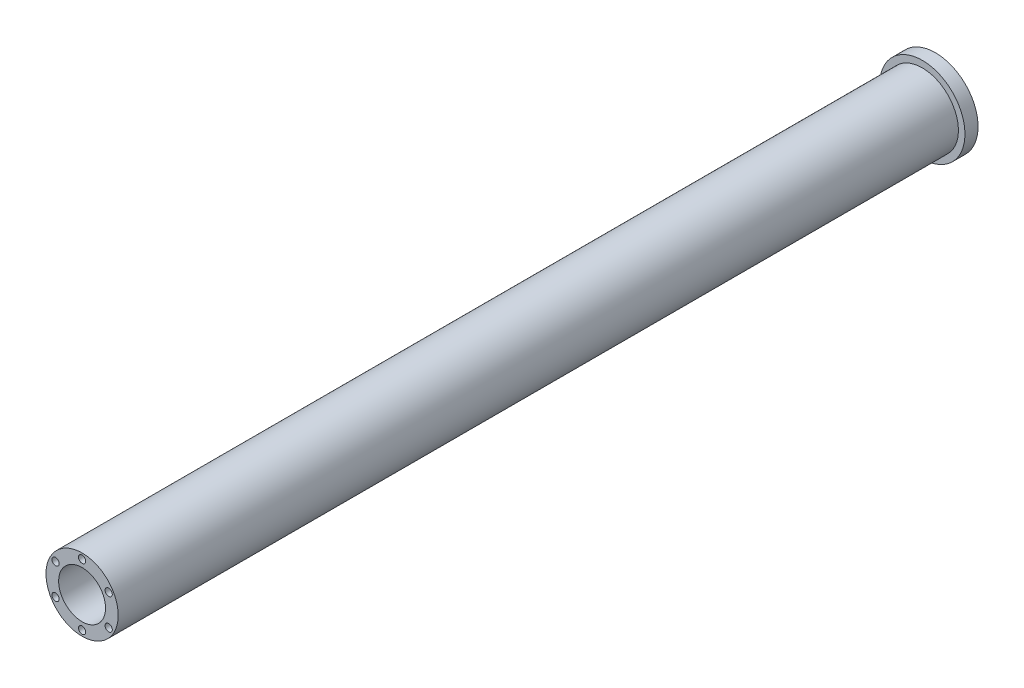
ISO-10303-21;
HEADER;
FILE_DESCRIPTION(('STEP AP214'),'2;1');
FILE_NAME('part.step','',(''),(''),'','','');
FILE_SCHEMA(('AUTOMOTIVE_DESIGN { 1 0 10303 214 1 1 1 1 }'));
ENDSEC;
DATA;
#1=APPLICATION_CONTEXT('core data for automotive mechanical design processes');
#2=APPLICATION_PROTOCOL_DEFINITION('international standard','automotive_design',2000,#1);
#3=PRODUCT_CONTEXT('',#1,'mechanical');
#4=PRODUCT('Part','Part','',(#3));
#5=PRODUCT_RELATED_PRODUCT_CATEGORY('part','',(#4));
#6=PRODUCT_DEFINITION_FORMATION('','',#4);
#7=PRODUCT_DEFINITION_CONTEXT('part definition',#1,'design');
#8=PRODUCT_DEFINITION('design','',#6,#7);
#9=PRODUCT_DEFINITION_SHAPE('','',#8);
#10=(LENGTH_UNIT() NAMED_UNIT(*) SI_UNIT(.MILLI.,.METRE.));
#11=(NAMED_UNIT(*) PLANE_ANGLE_UNIT() SI_UNIT($,.RADIAN.));
#12=(NAMED_UNIT(*) SI_UNIT($,.STERADIAN.) SOLID_ANGLE_UNIT());
#13=UNCERTAINTY_MEASURE_WITH_UNIT(LENGTH_MEASURE(1.E-05),#10,'distance_accuracy_value','');
#14=(GEOMETRIC_REPRESENTATION_CONTEXT(3) GLOBAL_UNCERTAINTY_ASSIGNED_CONTEXT((#13)) GLOBAL_UNIT_ASSIGNED_CONTEXT((#10,
#11,#12)) REPRESENTATION_CONTEXT('',''));
#15=CARTESIAN_POINT('',(0.,0.,0.));
#16=DIRECTION('',(0.,0.,1.));
#17=DIRECTION('',(1.,0.,0.));
#18=AXIS2_PLACEMENT_3D('',#15,#16,#17);
#19=CARTESIAN_POINT('',(0.,0.,90.));
#20=DIRECTION('',(0.,0.,1.));
#21=DIRECTION('',(1.,0.,0.));
#22=AXIS2_PLACEMENT_3D('',#19,#20,#21);
#23=PLANE('',#22);
#24=CARTESIAN_POINT('',(0.,0.,90.));
#25=DIRECTION('',(0.,0.,1.));
#26=DIRECTION('',(1.,0.,0.));
#27=AXIS2_PLACEMENT_3D('',#24,#25,#26);
#28=CIRCLE('',#27,13.);
#29=CARTESIAN_POINT('',(-13.,0.,90.));
#30=VERTEX_POINT('',#29);
#31=EDGE_CURVE('E135',#30,#30,#28,.T.);
#32=ORIENTED_EDGE('',*,*,#31,.T.);
#33=EDGE_LOOP('',(#32));
#34=FACE_BOUND('',#33,.T.);
#35=CARTESIAN_POINT('',(0.,0.,90.));
#36=DIRECTION('',(0.,0.,1.));
#37=DIRECTION('',(1.,0.,0.));
#38=AXIS2_PLACEMENT_3D('',#35,#36,#37);
#39=CIRCLE('',#38,23.6363636363636);
#40=CARTESIAN_POINT('',(-23.6363636363636,0.,90.));
#41=VERTEX_POINT('',#40);
#42=EDGE_CURVE('E11',#41,#41,#39,.T.);
#43=ORIENTED_EDGE('',*,*,#42,.F.);
#44=EDGE_LOOP('',(#43));
#45=FACE_BOUND('',#44,.T.);
#46=ADVANCED_FACE('F17',(#34,#45),#23,.F.);
#47=CARTESIAN_POINT('',(0.,0.,97.2727272727273));
#48=DIRECTION('',(0.,0.,1.));
#49=DIRECTION('',(1.,0.,0.));
#50=AXIS2_PLACEMENT_3D('',#47,#48,#49);
#51=PLANE('',#50);
#52=CARTESIAN_POINT('',(0.,0.,97.2727272727273));
#53=DIRECTION('',(0.,0.,-1.));
#54=DIRECTION('',(1.,0.,0.));
#55=AXIS2_PLACEMENT_3D('',#52,#53,#54);
#56=CIRCLE('',#55,20.);
#57=CARTESIAN_POINT('',(-20.,0.,97.2727272727273));
#58=VERTEX_POINT('',#57);
#59=EDGE_CURVE('E200',#58,#58,#56,.T.);
#60=ORIENTED_EDGE('',*,*,#59,.T.);
#61=EDGE_LOOP('',(#60));
#62=FACE_BOUND('',#61,.T.);
#63=CARTESIAN_POINT('',(0.,0.,97.2727272727273));
#64=DIRECTION('',(0.,0.,1.));
#65=DIRECTION('',(1.,0.,0.));
#66=AXIS2_PLACEMENT_3D('',#63,#64,#65);
#67=CIRCLE('',#66,23.6363636363636);
#68=CARTESIAN_POINT('',(-23.6363636363636,0.,97.2727272727273));
#69=VERTEX_POINT('',#68);
#70=EDGE_CURVE('E201',#69,#69,#67,.T.);
#71=ORIENTED_EDGE('',*,*,#70,.T.);
#72=EDGE_LOOP('',(#71));
#73=FACE_BOUND('',#72,.T.);
#74=ADVANCED_FACE('F213',(#62,#73),#51,.T.);
#75=CARTESIAN_POINT('',(0.,0.,90.));
#76=DIRECTION('',(0.,0.,1.));
#77=DIRECTION('',(1.,0.,0.));
#78=AXIS2_PLACEMENT_3D('',#75,#76,#77);
#79=CYLINDRICAL_SURFACE('',#78,23.6363636363636);
#80=ORIENTED_EDGE('',*,*,#70,.F.);
#81=DIRECTION('',(0.,0.,-1.));
#82=VECTOR('',#81,1.);
#83=CARTESIAN_POINT('',(-23.6363636363636,0.,90.));
#84=LINE('',#83,#82);
#85=EDGE_CURVE('E28',#69,#41,#84,.T.);
#86=ORIENTED_EDGE('',*,*,#85,.T.);
#87=ORIENTED_EDGE('',*,*,#42,.T.);
#88=ORIENTED_EDGE('',*,*,#85,.F.);
#89=EDGE_LOOP('',(#80,#86,#87,#88));
#90=FACE_BOUND('',#89,.T.);
#91=ADVANCED_FACE('F173',(#90),#79,.T.);
#92=CARTESIAN_POINT('',(0.,0.,562.727272727273));
#93=DIRECTION('',(0.,0.,1.));
#94=DIRECTION('',(1.,0.,0.));
#95=AXIS2_PLACEMENT_3D('',#92,#93,#94);
#96=PLANE('',#95);
#97=CARTESIAN_POINT('',(0.,0.,562.727272727273));
#98=DIRECTION('',(0.,0.,-1.));
#99=DIRECTION('',(1.,0.,0.));
#100=AXIS2_PLACEMENT_3D('',#97,#98,#99);
#101=CIRCLE('',#100,13.);
#102=CARTESIAN_POINT('',(-13.,0.,562.727272727273));
#103=VERTEX_POINT('',#102);
#104=EDGE_CURVE('E154',#103,#103,#101,.T.);
#105=ORIENTED_EDGE('',*,*,#104,.T.);
#106=EDGE_LOOP('',(#105));
#107=FACE_BOUND('',#106,.T.);
#108=CARTESIAN_POINT('',(0.,17.,562.727272727273));
#109=DIRECTION('',(0.,0.,-1.));
#110=DIRECTION('',(1.,0.,0.));
#111=AXIS2_PLACEMENT_3D('',#108,#109,#110);
#112=CIRCLE('',#111,2.);
#113=CARTESIAN_POINT('',(-2.,17.,562.727272727273));
#114=VERTEX_POINT('',#113);
#115=EDGE_CURVE('E177',#114,#114,#112,.T.);
#116=ORIENTED_EDGE('',*,*,#115,.T.);
#117=EDGE_LOOP('',(#116));
#118=FACE_BOUND('',#117,.T.);
#119=CARTESIAN_POINT('',(-14.7224318643355,-8.5,562.727272727273));
#120=DIRECTION('',(0.,0.,-1.));
#121=DIRECTION('',(1.,0.,0.));
#122=AXIS2_PLACEMENT_3D('',#119,#120,#121);
#123=CIRCLE('',#122,2.);
#124=CARTESIAN_POINT('',(-16.7224318643355,-8.5,562.727272727273));
#125=VERTEX_POINT('',#124);
#126=EDGE_CURVE('E99',#125,#125,#123,.T.);
#127=ORIENTED_EDGE('',*,*,#126,.T.);
#128=EDGE_LOOP('',(#127));
#129=FACE_BOUND('',#128,.T.);
#130=CARTESIAN_POINT('',(0.,-17.,562.727272727273));
#131=DIRECTION('',(0.,0.,-1.));
#132=DIRECTION('',(1.,0.,0.));
#133=AXIS2_PLACEMENT_3D('',#130,#131,#132);
#134=CIRCLE('',#133,2.);
#135=CARTESIAN_POINT('',(-2.,-17.,562.727272727273));
#136=VERTEX_POINT('',#135);
#137=EDGE_CURVE('E128',#136,#136,#134,.T.);
#138=ORIENTED_EDGE('',*,*,#137,.T.);
#139=EDGE_LOOP('',(#138));
#140=FACE_BOUND('',#139,.T.);
#141=CARTESIAN_POINT('',(14.7224318643355,8.5,562.727272727273));
#142=DIRECTION('',(0.,0.,-1.));
#143=DIRECTION('',(1.,0.,0.));
#144=AXIS2_PLACEMENT_3D('',#141,#142,#143);
#145=CIRCLE('',#144,2.);
#146=CARTESIAN_POINT('',(12.7224318643355,8.5,562.727272727273));
#147=VERTEX_POINT('',#146);
#148=EDGE_CURVE('E117',#147,#147,#145,.T.);
#149=ORIENTED_EDGE('',*,*,#148,.T.);
#150=EDGE_LOOP('',(#149));
#151=FACE_BOUND('',#150,.T.);
#152=CARTESIAN_POINT('',(-14.7224318643355,8.5,562.727272727273));
#153=DIRECTION('',(0.,0.,-1.));
#154=DIRECTION('',(1.,0.,0.));
#155=AXIS2_PLACEMENT_3D('',#152,#153,#154);
#156=CIRCLE('',#155,2.);
#157=CARTESIAN_POINT('',(-16.7224318643355,8.5,562.727272727273));
#158=VERTEX_POINT('',#157);
#159=EDGE_CURVE('E119',#158,#158,#156,.T.);
#160=ORIENTED_EDGE('',*,*,#159,.T.);
#161=EDGE_LOOP('',(#160));
#162=FACE_BOUND('',#161,.T.);
#163=CARTESIAN_POINT('',(14.7224318643355,-8.5,562.727272727273));
#164=DIRECTION('',(0.,0.,-1.));
#165=DIRECTION('',(1.,0.,0.));
#166=AXIS2_PLACEMENT_3D('',#163,#164,#165);
#167=CIRCLE('',#166,2.);
#168=CARTESIAN_POINT('',(12.7224318643355,-8.5,562.727272727273));
#169=VERTEX_POINT('',#168);
#170=EDGE_CURVE('E142',#169,#169,#167,.T.);
#171=ORIENTED_EDGE('',*,*,#170,.T.);
#172=EDGE_LOOP('',(#171));
#173=FACE_BOUND('',#172,.T.);
#174=CARTESIAN_POINT('',(0.,0.,562.727272727273));
#175=DIRECTION('',(0.,0.,1.));
#176=DIRECTION('',(1.,0.,0.));
#177=AXIS2_PLACEMENT_3D('',#174,#175,#176);
#178=CIRCLE('',#177,20.);
#179=CARTESIAN_POINT('',(-20.,0.,562.727272727273));
#180=VERTEX_POINT('',#179);
#181=EDGE_CURVE('E130',#180,#180,#178,.T.);
#182=ORIENTED_EDGE('',*,*,#181,.T.);
#183=EDGE_LOOP('',(#182));
#184=FACE_BOUND('',#183,.T.);
#185=ADVANCED_FACE('F104',(#107,#118,#129,#140,#151,#162,#173,#184),#96,.T.);
#186=CARTESIAN_POINT('',(0.,0.,90.));
#187=DIRECTION('',(0.,0.,1.));
#188=DIRECTION('',(1.,0.,0.));
#189=AXIS2_PLACEMENT_3D('',#186,#187,#188);
#190=CYLINDRICAL_SURFACE('',#189,20.);
#191=ORIENTED_EDGE('',*,*,#181,.F.);
#192=DIRECTION('',(0.,0.,-1.));
#193=VECTOR('',#192,1.);
#194=CARTESIAN_POINT('',(-20.,0.,90.));
#195=LINE('',#194,#193);
#196=EDGE_CURVE('E134',#180,#58,#195,.T.);
#197=ORIENTED_EDGE('',*,*,#196,.T.);
#198=ORIENTED_EDGE('',*,*,#59,.F.);
#199=ORIENTED_EDGE('',*,*,#196,.F.);
#200=EDGE_LOOP('',(#191,#197,#198,#199));
#201=FACE_BOUND('',#200,.T.);
#202=ADVANCED_FACE('F172',(#201),#190,.T.);
#203=CARTESIAN_POINT('',(0.,0.,562.727272727273));
#204=DIRECTION('',(0.,0.,-1.));
#205=DIRECTION('',(1.,0.,0.));
#206=AXIS2_PLACEMENT_3D('',#203,#204,#205);
#207=CYLINDRICAL_SURFACE('',#206,13.);
#208=ORIENTED_EDGE('',*,*,#104,.F.);
#209=DIRECTION('',(0.,0.,-1.));
#210=VECTOR('',#209,1.);
#211=CARTESIAN_POINT('',(-13.,0.,562.727272727273));
#212=LINE('',#211,#210);
#213=EDGE_CURVE('E150',#103,#30,#212,.T.);
#214=ORIENTED_EDGE('',*,*,#213,.T.);
#215=ORIENTED_EDGE('',*,*,#31,.F.);
#216=ORIENTED_EDGE('',*,*,#213,.F.);
#217=EDGE_LOOP('',(#208,#214,#215,#216));
#218=FACE_BOUND('',#217,.T.);
#219=ADVANCED_FACE('F166',(#218),#207,.F.);
#220=CARTESIAN_POINT('',(0.,17.,542.727272727273));
#221=DIRECTION('',(0.,0.,1.));
#222=DIRECTION('',(1.,0.,0.));
#223=AXIS2_PLACEMENT_3D('',#220,#221,#222);
#224=PLANE('',#223);
#225=CARTESIAN_POINT('',(0.,17.,542.727272727273));
#226=DIRECTION('',(0.,0.,-1.));
#227=DIRECTION('',(1.,0.,0.));
#228=AXIS2_PLACEMENT_3D('',#225,#226,#227);
#229=CIRCLE('',#228,2.);
#230=CARTESIAN_POINT('',(-2.,17.,542.727272727273));
#231=VERTEX_POINT('',#230);
#232=EDGE_CURVE('E158',#231,#231,#229,.T.);
#233=ORIENTED_EDGE('',*,*,#232,.F.);
#234=EDGE_LOOP('',(#233));
#235=FACE_BOUND('',#234,.T.);
#236=ADVANCED_FACE('F19',(#235),#224,.T.);
#237=CARTESIAN_POINT('',(0.,17.,562.727272727273));
#238=DIRECTION('',(0.,0.,-1.));
#239=DIRECTION('',(1.,0.,0.));
#240=AXIS2_PLACEMENT_3D('',#237,#238,#239);
#241=CYLINDRICAL_SURFACE('',#240,2.);
#242=ORIENTED_EDGE('',*,*,#115,.F.);
#243=DIRECTION('',(0.,0.,-1.));
#244=VECTOR('',#243,1.);
#245=CARTESIAN_POINT('',(-2.,17.,562.727272727273));
#246=LINE('',#245,#244);
#247=EDGE_CURVE('E181',#114,#231,#246,.T.);
#248=ORIENTED_EDGE('',*,*,#247,.T.);
#249=ORIENTED_EDGE('',*,*,#232,.T.);
#250=ORIENTED_EDGE('',*,*,#247,.F.);
#251=EDGE_LOOP('',(#242,#248,#249,#250));
#252=FACE_BOUND('',#251,.T.);
#253=ADVANCED_FACE('F336',(#252),#241,.F.);
#254=CARTESIAN_POINT('',(-14.7224318643355,-8.5,542.727272727273));
#255=DIRECTION('',(0.,0.,1.));
#256=DIRECTION('',(1.,0.,0.));
#257=AXIS2_PLACEMENT_3D('',#254,#255,#256);
#258=PLANE('',#257);
#259=CARTESIAN_POINT('',(-14.7224318643355,-8.5,542.727272727273));
#260=DIRECTION('',(0.,0.,-1.));
#261=DIRECTION('',(1.,0.,0.));
#262=AXIS2_PLACEMENT_3D('',#259,#260,#261);
#263=CIRCLE('',#262,2.);
#264=CARTESIAN_POINT('',(-16.7224318643355,-8.5,542.727272727273));
#265=VERTEX_POINT('',#264);
#266=EDGE_CURVE('E101',#265,#265,#263,.T.);
#267=ORIENTED_EDGE('',*,*,#266,.F.);
#268=EDGE_LOOP('',(#267));
#269=FACE_BOUND('',#268,.T.);
#270=ADVANCED_FACE('F308',(#269),#258,.T.);
#271=CARTESIAN_POINT('',(-14.7224318643355,-8.5,562.727272727273));
#272=DIRECTION('',(0.,0.,-1.));
#273=DIRECTION('',(1.,0.,0.));
#274=AXIS2_PLACEMENT_3D('',#271,#272,#273);
#275=CYLINDRICAL_SURFACE('',#274,2.);
#276=ORIENTED_EDGE('',*,*,#126,.F.);
#277=DIRECTION('',(0.,0.,-1.));
#278=VECTOR('',#277,1.);
#279=CARTESIAN_POINT('',(-16.7224318643355,-8.5,562.727272727273));
#280=LINE('',#279,#278);
#281=EDGE_CURVE('E96',#125,#265,#280,.T.);
#282=ORIENTED_EDGE('',*,*,#281,.T.);
#283=ORIENTED_EDGE('',*,*,#266,.T.);
#284=ORIENTED_EDGE('',*,*,#281,.F.);
#285=EDGE_LOOP('',(#276,#282,#283,#284));
#286=FACE_BOUND('',#285,.T.);
#287=ADVANCED_FACE('F98',(#286),#275,.F.);
#288=CARTESIAN_POINT('',(0.,-17.,542.727272727273));
#289=DIRECTION('',(0.,0.,1.));
#290=DIRECTION('',(1.,0.,0.));
#291=AXIS2_PLACEMENT_3D('',#288,#289,#290);
#292=PLANE('',#291);
#293=CARTESIAN_POINT('',(0.,-17.,542.727272727273));
#294=DIRECTION('',(0.,0.,-1.));
#295=DIRECTION('',(1.,0.,0.));
#296=AXIS2_PLACEMENT_3D('',#293,#294,#295);
#297=CIRCLE('',#296,2.);
#298=CARTESIAN_POINT('',(-2.,-17.,542.727272727273));
#299=VERTEX_POINT('',#298);
#300=EDGE_CURVE('E107',#299,#299,#297,.T.);
#301=ORIENTED_EDGE('',*,*,#300,.F.);
#302=EDGE_LOOP('',(#301));
#303=FACE_BOUND('',#302,.T.);
#304=ADVANCED_FACE('F307',(#303),#292,.T.);
#305=CARTESIAN_POINT('',(0.,-17.,562.727272727273));
#306=DIRECTION('',(0.,0.,-1.));
#307=DIRECTION('',(1.,0.,0.));
#308=AXIS2_PLACEMENT_3D('',#305,#306,#307);
#309=CYLINDRICAL_SURFACE('',#308,2.);
#310=ORIENTED_EDGE('',*,*,#137,.F.);
#311=DIRECTION('',(0.,0.,-1.));
#312=VECTOR('',#311,1.);
#313=CARTESIAN_POINT('',(-2.,-17.,562.727272727273));
#314=LINE('',#313,#312);
#315=EDGE_CURVE('E113',#136,#299,#314,.T.);
#316=ORIENTED_EDGE('',*,*,#315,.T.);
#317=ORIENTED_EDGE('',*,*,#300,.T.);
#318=ORIENTED_EDGE('',*,*,#315,.F.);
#319=EDGE_LOOP('',(#310,#316,#317,#318));
#320=FACE_BOUND('',#319,.T.);
#321=ADVANCED_FACE('F329',(#320),#309,.F.);
#322=CARTESIAN_POINT('',(14.7224318643355,8.5,542.727272727273));
#323=DIRECTION('',(0.,0.,1.));
#324=DIRECTION('',(1.,0.,0.));
#325=AXIS2_PLACEMENT_3D('',#322,#323,#324);
#326=PLANE('',#325);
#327=CARTESIAN_POINT('',(14.7224318643355,8.5,542.727272727273));
#328=DIRECTION('',(0.,0.,-1.));
#329=DIRECTION('',(1.,0.,0.));
#330=AXIS2_PLACEMENT_3D('',#327,#328,#329);
#331=CIRCLE('',#330,2.);
#332=CARTESIAN_POINT('',(12.7224318643355,8.5,542.727272727273));
#333=VERTEX_POINT('',#332);
#334=EDGE_CURVE('E125',#333,#333,#331,.T.);
#335=ORIENTED_EDGE('',*,*,#334,.F.);
#336=EDGE_LOOP('',(#335));
#337=FACE_BOUND('',#336,.T.);
#338=ADVANCED_FACE('F323',(#337),#326,.T.);
#339=CARTESIAN_POINT('',(14.7224318643355,8.5,562.727272727273));
#340=DIRECTION('',(0.,0.,-1.));
#341=DIRECTION('',(1.,0.,0.));
#342=AXIS2_PLACEMENT_3D('',#339,#340,#341);
#343=CYLINDRICAL_SURFACE('',#342,2.);
#344=ORIENTED_EDGE('',*,*,#148,.F.);
#345=DIRECTION('',(0.,0.,-1.));
#346=VECTOR('',#345,1.);
#347=CARTESIAN_POINT('',(12.7224318643355,8.5,562.727272727273));
#348=LINE('',#347,#346);
#349=EDGE_CURVE('E129',#147,#333,#348,.T.);
#350=ORIENTED_EDGE('',*,*,#349,.T.);
#351=ORIENTED_EDGE('',*,*,#334,.T.);
#352=ORIENTED_EDGE('',*,*,#349,.F.);
#353=EDGE_LOOP('',(#344,#350,#351,#352));
#354=FACE_BOUND('',#353,.T.);
#355=ADVANCED_FACE('F328',(#354),#343,.F.);
#356=CARTESIAN_POINT('',(-14.7224318643355,8.5,542.727272727273));
#357=DIRECTION('',(0.,0.,1.));
#358=DIRECTION('',(1.,0.,0.));
#359=AXIS2_PLACEMENT_3D('',#356,#357,#358);
#360=PLANE('',#359);
#361=CARTESIAN_POINT('',(-14.7224318643355,8.5,542.727272727273));
#362=DIRECTION('',(0.,0.,-1.));
#363=DIRECTION('',(1.,0.,0.));
#364=AXIS2_PLACEMENT_3D('',#361,#362,#363);
#365=CIRCLE('',#364,2.);
#366=CARTESIAN_POINT('',(-16.7224318643355,8.5,542.727272727273));
#367=VERTEX_POINT('',#366);
#368=EDGE_CURVE('E21',#367,#367,#365,.T.);
#369=ORIENTED_EDGE('',*,*,#368,.F.);
#370=EDGE_LOOP('',(#369));
#371=FACE_BOUND('',#370,.T.);
#372=ADVANCED_FACE('F354',(#371),#360,.T.);
#373=CARTESIAN_POINT('',(-14.7224318643355,8.5,562.727272727273));
#374=DIRECTION('',(0.,0.,-1.));
#375=DIRECTION('',(1.,0.,0.));
#376=AXIS2_PLACEMENT_3D('',#373,#374,#375);
#377=CYLINDRICAL_SURFACE('',#376,2.);
#378=ORIENTED_EDGE('',*,*,#159,.F.);
#379=DIRECTION('',(0.,0.,-1.));
#380=VECTOR('',#379,1.);
#381=CARTESIAN_POINT('',(-16.7224318643355,8.5,562.727272727273));
#382=LINE('',#381,#380);
#383=EDGE_CURVE('E123',#158,#367,#382,.T.);
#384=ORIENTED_EDGE('',*,*,#383,.T.);
#385=ORIENTED_EDGE('',*,*,#368,.T.);
#386=ORIENTED_EDGE('',*,*,#383,.F.);
#387=EDGE_LOOP('',(#378,#384,#385,#386));
#388=FACE_BOUND('',#387,.T.);
#389=ADVANCED_FACE('F298',(#388),#377,.F.);
#390=CARTESIAN_POINT('',(14.7224318643355,-8.5,542.727272727273));
#391=DIRECTION('',(0.,0.,1.));
#392=DIRECTION('',(1.,0.,0.));
#393=AXIS2_PLACEMENT_3D('',#390,#391,#392);
#394=PLANE('',#393);
#395=CARTESIAN_POINT('',(14.7224318643355,-8.5,542.727272727273));
#396=DIRECTION('',(0.,0.,-1.));
#397=DIRECTION('',(1.,0.,0.));
#398=AXIS2_PLACEMENT_3D('',#395,#396,#397);
#399=CIRCLE('',#398,2.);
#400=CARTESIAN_POINT('',(12.7224318643355,-8.5,542.727272727273));
#401=VERTEX_POINT('',#400);
#402=EDGE_CURVE('E124',#401,#401,#399,.T.);
#403=ORIENTED_EDGE('',*,*,#402,.F.);
#404=EDGE_LOOP('',(#403));
#405=FACE_BOUND('',#404,.T.);
#406=ADVANCED_FACE('F290',(#405),#394,.T.);
#407=CARTESIAN_POINT('',(14.7224318643355,-8.5,562.727272727273));
#408=DIRECTION('',(0.,0.,-1.));
#409=DIRECTION('',(1.,0.,0.));
#410=AXIS2_PLACEMENT_3D('',#407,#408,#409);
#411=CYLINDRICAL_SURFACE('',#410,2.);
#412=ORIENTED_EDGE('',*,*,#170,.F.);
#413=DIRECTION('',(0.,0.,-1.));
#414=VECTOR('',#413,1.);
#415=CARTESIAN_POINT('',(12.7224318643355,-8.5,562.727272727273));
#416=LINE('',#415,#414);
#417=EDGE_CURVE('E146',#169,#401,#416,.T.);
#418=ORIENTED_EDGE('',*,*,#417,.T.);
#419=ORIENTED_EDGE('',*,*,#402,.T.);
#420=ORIENTED_EDGE('',*,*,#417,.F.);
#421=EDGE_LOOP('',(#412,#418,#419,#420));
#422=FACE_BOUND('',#421,.T.);
#423=ADVANCED_FACE('F237',(#422),#411,.F.);
#424=CLOSED_SHELL('',(#46,#74,#91,#185,#202,#219,#236,#253,#270,#287,#304,#321,#338,#355,#372,
#389,#406,#423));
#425=MANIFOLD_SOLID_BREP('B1',#424);
#426=ADVANCED_BREP_SHAPE_REPRESENTATION('',(#18,#425),#14);
#427=SHAPE_DEFINITION_REPRESENTATION(#9,#426);
ENDSEC;
END-ISO-10303-21;
